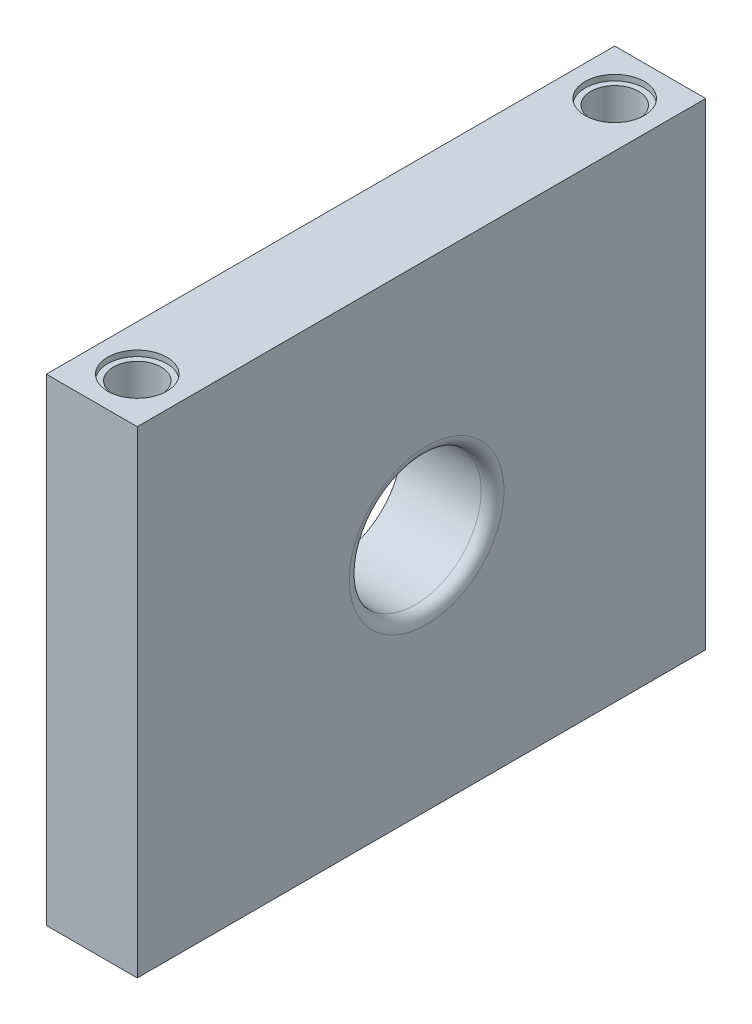
ISO-10303-21;
HEADER;
FILE_DESCRIPTION(('STEP AP214'),'2;1');
FILE_NAME('part.step','',(''),(''),'','','');
FILE_SCHEMA(('AUTOMOTIVE_DESIGN { 1 0 10303 214 1 1 1 1 }'));
ENDSEC;
DATA;
#1=APPLICATION_CONTEXT('core data for automotive mechanical design processes');
#2=APPLICATION_PROTOCOL_DEFINITION('international standard','automotive_design',2000,#1);
#3=PRODUCT_CONTEXT('',#1,'mechanical');
#4=PRODUCT('Part','Part','',(#3));
#5=PRODUCT_RELATED_PRODUCT_CATEGORY('part','',(#4));
#6=PRODUCT_DEFINITION_FORMATION('','',#4);
#7=PRODUCT_DEFINITION_CONTEXT('part definition',#1,'design');
#8=PRODUCT_DEFINITION('design','',#6,#7);
#9=PRODUCT_DEFINITION_SHAPE('','',#8);
#10=(LENGTH_UNIT() NAMED_UNIT(*) SI_UNIT(.MILLI.,.METRE.));
#11=(NAMED_UNIT(*) PLANE_ANGLE_UNIT() SI_UNIT($,.RADIAN.));
#12=(NAMED_UNIT(*) SI_UNIT($,.STERADIAN.) SOLID_ANGLE_UNIT());
#13=UNCERTAINTY_MEASURE_WITH_UNIT(LENGTH_MEASURE(1.E-05),#10,'distance_accuracy_value','');
#14=(GEOMETRIC_REPRESENTATION_CONTEXT(3) GLOBAL_UNCERTAINTY_ASSIGNED_CONTEXT((#13)) GLOBAL_UNIT_ASSIGNED_CONTEXT((#10,
#11,#12)) REPRESENTATION_CONTEXT('',''));
#15=CARTESIAN_POINT('',(0.,0.,0.));
#16=DIRECTION('',(0.,0.,1.));
#17=DIRECTION('',(1.,0.,0.));
#18=AXIS2_PLACEMENT_3D('',#15,#16,#17);
#19=CARTESIAN_POINT('',(-14.2230483271375,-42.,-32.3847583643123));
#20=DIRECTION('',(0.,1.,0.));
#21=DIRECTION('',(0.,0.,1.));
#22=AXIS2_PLACEMENT_3D('',#19,#20,#21);
#23=CYLINDRICAL_SURFACE('',#22,2.1);
#24=CARTESIAN_POINT('',(-14.2230483271375,-41.5,-32.3847583643123));
#25=DIRECTION('',(0.,-1.,0.));
#26=DIRECTION('',(0.,0.,-1.));
#27=AXIS2_PLACEMENT_3D('',#24,#25,#26);
#28=CIRCLE('',#27,2.1);
#29=CARTESIAN_POINT('',(-14.2230483271375,-41.5,-34.4847583643123));
#30=VERTEX_POINT('',#29);
#31=EDGE_CURVE('E91',#30,#30,#28,.T.);
#32=ORIENTED_EDGE('',*,*,#31,.T.);
#33=EDGE_LOOP('',(#32));
#34=FACE_BOUND('',#33,.T.);
#35=CARTESIAN_POINT('',(-14.2230483271375,-0.5,-32.3847583643123));
#36=DIRECTION('',(0.,1.,0.));
#37=DIRECTION('',(0.,0.,1.));
#38=AXIS2_PLACEMENT_3D('',#35,#36,#37);
#39=CIRCLE('',#38,2.1);
#40=CARTESIAN_POINT('',(-14.2230483271375,-0.5,-30.2847583643123));
#41=VERTEX_POINT('',#40);
#42=EDGE_CURVE('E41',#41,#41,#39,.F.);
#43=ORIENTED_EDGE('',*,*,#42,.F.);
#44=EDGE_LOOP('',(#43));
#45=FACE_BOUND('',#44,.T.);
#46=ADVANCED_FACE('F37',(#34,#45),#23,.F.);
#47=CARTESIAN_POINT('',(-14.2230483271375,-42.,9.61524163568774));
#48=DIRECTION('',(0.,1.,0.));
#49=DIRECTION('',(0.,0.,1.));
#50=AXIS2_PLACEMENT_3D('',#47,#48,#49);
#51=CYLINDRICAL_SURFACE('',#50,2.1);
#52=CARTESIAN_POINT('',(-14.2230483271375,-41.5,9.61524163568774));
#53=DIRECTION('',(0.,-1.,0.));
#54=DIRECTION('',(0.,0.,-1.));
#55=AXIS2_PLACEMENT_3D('',#52,#53,#54);
#56=CIRCLE('',#55,2.1);
#57=CARTESIAN_POINT('',(-14.2230483271375,-41.5,7.51524163568774));
#58=VERTEX_POINT('',#57);
#59=EDGE_CURVE('E107',#58,#58,#56,.F.);
#60=ORIENTED_EDGE('',*,*,#59,.F.);
#61=EDGE_LOOP('',(#60));
#62=FACE_BOUND('',#61,.T.);
#63=CARTESIAN_POINT('',(-14.2230483271375,-0.5,9.61524163568774));
#64=DIRECTION('',(0.,1.,0.));
#65=DIRECTION('',(0.,0.,1.));
#66=AXIS2_PLACEMENT_3D('',#63,#64,#65);
#67=CIRCLE('',#66,2.1);
#68=CARTESIAN_POINT('',(-14.2230483271375,-0.5,11.7152416356877));
#69=VERTEX_POINT('',#68);
#70=EDGE_CURVE('E105',#69,#69,#67,.T.);
#71=ORIENTED_EDGE('',*,*,#70,.T.);
#72=EDGE_LOOP('',(#71));
#73=FACE_BOUND('',#72,.T.);
#74=ADVANCED_FACE('F175',(#62,#73),#51,.F.);
#75=CARTESIAN_POINT('',(-10.2230483271375,3.,13.6152416356877));
#76=DIRECTION('',(0.,0.,-1.));
#77=DIRECTION('',(-1.,0.,0.));
#78=AXIS2_PLACEMENT_3D('',#75,#76,#77);
#79=PLANE('',#78);
#80=DIRECTION('',(0.,1.,0.));
#81=VECTOR('',#80,1.);
#82=CARTESIAN_POINT('',(-10.2230483271376,-42.,13.6152416356877));
#83=LINE('',#82,#81);
#84=CARTESIAN_POINT('',(-10.2230483271376,-42.,13.6152416356877));
#85=VERTEX_POINT('',#84);
#86=CARTESIAN_POINT('',(-10.2230483271376,0.,13.6152416356877));
#87=VERTEX_POINT('',#86);
#88=EDGE_CURVE('E90',#85,#87,#83,.T.);
#89=ORIENTED_EDGE('',*,*,#88,.T.);
#90=DIRECTION('',(1.,0.,0.));
#91=VECTOR('',#90,1.);
#92=CARTESIAN_POINT('',(14.7769516728625,0.,13.6152416356877));
#93=LINE('',#92,#91);
#94=CARTESIAN_POINT('',(-18.2230483271375,0.,13.6152416356877));
#95=VERTEX_POINT('',#94);
#96=EDGE_CURVE('E79',#95,#87,#93,.T.);
#97=ORIENTED_EDGE('',*,*,#96,.F.);
#98=DIRECTION('',(0.,1.,0.));
#99=VECTOR('',#98,1.);
#100=CARTESIAN_POINT('',(-18.2230483271375,3.,13.6152416356877));
#101=LINE('',#100,#99);
#102=CARTESIAN_POINT('',(-18.2230483271376,-42.,13.6152416356877));
#103=VERTEX_POINT('',#102);
#104=EDGE_CURVE('E55',#103,#95,#101,.T.);
#105=ORIENTED_EDGE('',*,*,#104,.F.);
#106=DIRECTION('',(-1.,0.,0.));
#107=VECTOR('',#106,1.);
#108=CARTESIAN_POINT('',(-18.2230483271376,-42.,13.6152416356877));
#109=LINE('',#108,#107);
#110=EDGE_CURVE('E147',#85,#103,#109,.T.);
#111=ORIENTED_EDGE('',*,*,#110,.F.);
#112=EDGE_LOOP('',(#89,#97,#105,#111));
#113=FACE_BOUND('',#112,.T.);
#114=ADVANCED_FACE('F88',(#113),#79,.F.);
#115=CARTESIAN_POINT('',(-10.2230483271376,3.,-36.3847583643123));
#116=DIRECTION('',(0.,0.,1.));
#117=DIRECTION('',(1.,0.,0.));
#118=AXIS2_PLACEMENT_3D('',#115,#116,#117);
#119=PLANE('',#118);
#120=DIRECTION('',(0.,-1.,0.));
#121=VECTOR('',#120,1.);
#122=CARTESIAN_POINT('',(-18.2230483271376,3.,-36.3847583643123));
#123=LINE('',#122,#121);
#124=CARTESIAN_POINT('',(-18.2230483271376,0.,-36.3847583643123));
#125=VERTEX_POINT('',#124);
#126=CARTESIAN_POINT('',(-18.2230483271376,-42.,-36.3847583643123));
#127=VERTEX_POINT('',#126);
#128=EDGE_CURVE('E98',#125,#127,#123,.T.);
#129=ORIENTED_EDGE('',*,*,#128,.F.);
#130=DIRECTION('',(1.,0.,0.));
#131=VECTOR('',#130,1.);
#132=CARTESIAN_POINT('',(14.7769516728625,0.,-36.3847583643123));
#133=LINE('',#132,#131);
#134=CARTESIAN_POINT('',(-10.2230483271376,0.,-36.3847583643123));
#135=VERTEX_POINT('',#134);
#136=EDGE_CURVE('E82',#125,#135,#133,.T.);
#137=ORIENTED_EDGE('',*,*,#136,.T.);
#138=DIRECTION('',(0.,1.,0.));
#139=VECTOR('',#138,1.);
#140=CARTESIAN_POINT('',(-10.2230483271376,-42.,-36.3847583643123));
#141=LINE('',#140,#139);
#142=CARTESIAN_POINT('',(-10.2230483271376,-42.,-36.3847583643123));
#143=VERTEX_POINT('',#142);
#144=EDGE_CURVE('E102',#143,#135,#141,.T.);
#145=ORIENTED_EDGE('',*,*,#144,.F.);
#146=DIRECTION('',(1.,0.,0.));
#147=VECTOR('',#146,1.);
#148=CARTESIAN_POINT('',(-18.2230483271376,-42.,-36.3847583643123));
#149=LINE('',#148,#147);
#150=EDGE_CURVE('E143',#127,#143,#149,.T.);
#151=ORIENTED_EDGE('',*,*,#150,.F.);
#152=EDGE_LOOP('',(#129,#137,#145,#151));
#153=FACE_BOUND('',#152,.T.);
#154=ADVANCED_FACE('F157',(#153),#119,.F.);
#155=CARTESIAN_POINT('',(-18.2230483271375,0.,0.));
#156=DIRECTION('',(-1.,0.,0.));
#157=DIRECTION('',(0.,0.,1.));
#158=AXIS2_PLACEMENT_3D('',#155,#156,#157);
#159=PLANE('',#158);
#160=DIRECTION('',(0.,0.,1.));
#161=VECTOR('',#160,1.);
#162=CARTESIAN_POINT('',(-18.2230483271375,0.,0.));
#163=LINE('',#162,#161);
#164=EDGE_CURVE('E77',#125,#95,#163,.T.);
#165=ORIENTED_EDGE('',*,*,#164,.F.);
#166=ORIENTED_EDGE('',*,*,#128,.T.);
#167=DIRECTION('',(0.,0.,-1.));
#168=VECTOR('',#167,1.);
#169=CARTESIAN_POINT('',(-18.2230483271376,-42.,-36.3847583643123));
#170=LINE('',#169,#168);
#171=EDGE_CURVE('E97',#103,#127,#170,.T.);
#172=ORIENTED_EDGE('',*,*,#171,.F.);
#173=ORIENTED_EDGE('',*,*,#104,.T.);
#174=EDGE_LOOP('',(#165,#166,#172,#173));
#175=FACE_BOUND('',#174,.T.);
#176=CARTESIAN_POINT('',(-18.2230483271375,-21.,-11.836279123996));
#177=DIRECTION('',(-1.,0.,0.));
#178=DIRECTION('',(0.,0.,1.));
#179=AXIS2_PLACEMENT_3D('',#176,#177,#178);
#180=CIRCLE('',#179,5.80237020535575);
#181=CARTESIAN_POINT('',(-18.2230483271375,-21.,-6.03390891864026));
#182=VERTEX_POINT('',#181);
#183=EDGE_CURVE('E85',#182,#182,#180,.T.);
#184=ORIENTED_EDGE('',*,*,#183,.F.);
#185=EDGE_LOOP('',(#184));
#186=FACE_BOUND('',#185,.T.);
#187=ADVANCED_FACE('F94',(#175,#186),#159,.T.);
#188=CARTESIAN_POINT('',(-10.2230483271376,-42.,-36.3847583643123));
#189=DIRECTION('',(-1.,0.,0.));
#190=DIRECTION('',(0.,0.,1.));
#191=AXIS2_PLACEMENT_3D('',#188,#189,#190);
#192=PLANE('',#191);
#193=CARTESIAN_POINT('',(-10.2230483271376,-21.,-11.836279123996));
#194=DIRECTION('',(-1.,0.,0.));
#195=DIRECTION('',(0.,0.,1.));
#196=AXIS2_PLACEMENT_3D('',#193,#194,#195);
#197=CIRCLE('',#196,6.80237020535575);
#198=CARTESIAN_POINT('',(-10.2230483271376,-21.,-5.03390891864026));
#199=VERTEX_POINT('',#198);
#200=EDGE_CURVE('E47',#199,#199,#197,.T.);
#201=ORIENTED_EDGE('',*,*,#200,.T.);
#202=EDGE_LOOP('',(#201));
#203=FACE_BOUND('',#202,.T.);
#204=DIRECTION('',(0.,0.,1.));
#205=VECTOR('',#204,1.);
#206=CARTESIAN_POINT('',(-10.2230483271376,0.,-36.3847583643123));
#207=LINE('',#206,#205);
#208=EDGE_CURVE('E133',#135,#87,#207,.T.);
#209=ORIENTED_EDGE('',*,*,#208,.T.);
#210=ORIENTED_EDGE('',*,*,#88,.F.);
#211=DIRECTION('',(0.,0.,1.));
#212=VECTOR('',#211,1.);
#213=CARTESIAN_POINT('',(-10.2230483271376,-42.,-36.3847583643123));
#214=LINE('',#213,#212);
#215=EDGE_CURVE('E145',#143,#85,#214,.T.);
#216=ORIENTED_EDGE('',*,*,#215,.F.);
#217=ORIENTED_EDGE('',*,*,#144,.T.);
#218=EDGE_LOOP('',(#209,#210,#216,#217));
#219=FACE_BOUND('',#218,.T.);
#220=ADVANCED_FACE('F154',(#203,#219),#192,.F.);
#221=CARTESIAN_POINT('',(0.,-42.,0.));
#222=DIRECTION('',(0.,1.,0.));
#223=DIRECTION('',(0.,0.,1.));
#224=AXIS2_PLACEMENT_3D('',#221,#222,#223);
#225=PLANE('',#224);
#226=CARTESIAN_POINT('',(-14.2230483271375,-42.,-32.3847583643123));
#227=DIRECTION('',(0.,1.,0.));
#228=DIRECTION('',(0.,0.,1.));
#229=AXIS2_PLACEMENT_3D('',#226,#227,#228);
#230=CIRCLE('',#229,2.65);
#231=CARTESIAN_POINT('',(-14.2230483271375,-42.,-29.7347583643123));
#232=VERTEX_POINT('',#231);
#233=EDGE_CURVE('E134',#232,#232,#230,.T.);
#234=ORIENTED_EDGE('',*,*,#233,.T.);
#235=EDGE_LOOP('',(#234));
#236=FACE_BOUND('',#235,.T.);
#237=CARTESIAN_POINT('',(-14.2230483271375,-42.,9.61524163568773));
#238=DIRECTION('',(0.,1.,0.));
#239=DIRECTION('',(0.,0.,1.));
#240=AXIS2_PLACEMENT_3D('',#237,#238,#239);
#241=CIRCLE('',#240,2.65);
#242=CARTESIAN_POINT('',(-14.2230483271375,-42.,12.2652416356877));
#243=VERTEX_POINT('',#242);
#244=EDGE_CURVE('E129',#243,#243,#241,.T.);
#245=ORIENTED_EDGE('',*,*,#244,.T.);
#246=EDGE_LOOP('',(#245));
#247=FACE_BOUND('',#246,.T.);
#248=ORIENTED_EDGE('',*,*,#171,.T.);
#249=ORIENTED_EDGE('',*,*,#150,.T.);
#250=ORIENTED_EDGE('',*,*,#215,.T.);
#251=ORIENTED_EDGE('',*,*,#110,.T.);
#252=EDGE_LOOP('',(#248,#249,#250,#251));
#253=FACE_BOUND('',#252,.T.);
#254=ADVANCED_FACE('F159',(#236,#247,#253),#225,.F.);
#255=CARTESIAN_POINT('',(-14.2230483271375,-41.5,9.61524163568773));
#256=DIRECTION('',(0.,-1.,0.));
#257=DIRECTION('',(0.,0.,-1.));
#258=AXIS2_PLACEMENT_3D('',#255,#256,#257);
#259=CYLINDRICAL_SURFACE('',#258,2.65);
#260=CARTESIAN_POINT('',(-14.2230483271375,-41.5,9.61524163568773));
#261=DIRECTION('',(0.,1.,0.));
#262=DIRECTION('',(0.,0.,1.));
#263=AXIS2_PLACEMENT_3D('',#260,#261,#262);
#264=CIRCLE('',#263,2.65);
#265=CARTESIAN_POINT('',(-14.2230483271375,-41.5,12.2652416356877));
#266=VERTEX_POINT('',#265);
#267=EDGE_CURVE('E137',#266,#266,#264,.T.);
#268=ORIENTED_EDGE('',*,*,#267,.T.);
#269=EDGE_LOOP('',(#268));
#270=FACE_BOUND('',#269,.T.);
#271=ORIENTED_EDGE('',*,*,#244,.F.);
#272=EDGE_LOOP('',(#271));
#273=FACE_BOUND('',#272,.T.);
#274=ADVANCED_FACE('F161',(#270,#273),#259,.F.);
#275=CARTESIAN_POINT('',(-14.2230483271375,-41.5,9.61524163568773));
#276=DIRECTION('',(0.,-1.,0.));
#277=DIRECTION('',(0.,0.,1.));
#278=AXIS2_PLACEMENT_3D('',#275,#276,#277);
#279=PLANE('',#278);
#280=ORIENTED_EDGE('',*,*,#59,.T.);
#281=EDGE_LOOP('',(#280));
#282=FACE_BOUND('',#281,.T.);
#283=ORIENTED_EDGE('',*,*,#267,.F.);
#284=EDGE_LOOP('',(#283));
#285=FACE_BOUND('',#284,.T.);
#286=ADVANCED_FACE('F168',(#282,#285),#279,.T.);
#287=CARTESIAN_POINT('',(-14.2230483271375,-41.5,-32.3847583643123));
#288=DIRECTION('',(0.,-1.,0.));
#289=DIRECTION('',(0.,0.,-1.));
#290=AXIS2_PLACEMENT_3D('',#287,#288,#289);
#291=CYLINDRICAL_SURFACE('',#290,2.65);
#292=CARTESIAN_POINT('',(-14.2230483271375,-41.5,-32.3847583643123));
#293=DIRECTION('',(0.,1.,0.));
#294=DIRECTION('',(0.,0.,1.));
#295=AXIS2_PLACEMENT_3D('',#292,#293,#294);
#296=CIRCLE('',#295,2.65);
#297=CARTESIAN_POINT('',(-14.2230483271375,-41.5,-29.7347583643123));
#298=VERTEX_POINT('',#297);
#299=EDGE_CURVE('E130',#298,#298,#296,.T.);
#300=ORIENTED_EDGE('',*,*,#299,.T.);
#301=EDGE_LOOP('',(#300));
#302=FACE_BOUND('',#301,.T.);
#303=ORIENTED_EDGE('',*,*,#233,.F.);
#304=EDGE_LOOP('',(#303));
#305=FACE_BOUND('',#304,.T.);
#306=ADVANCED_FACE('F197',(#302,#305),#291,.F.);
#307=CARTESIAN_POINT('',(-14.2230483271375,-41.5,-32.3847583643123));
#308=DIRECTION('',(0.,-1.,0.));
#309=DIRECTION('',(0.,0.,1.));
#310=AXIS2_PLACEMENT_3D('',#307,#308,#309);
#311=PLANE('',#310);
#312=ORIENTED_EDGE('',*,*,#31,.F.);
#313=EDGE_LOOP('',(#312));
#314=FACE_BOUND('',#313,.T.);
#315=ORIENTED_EDGE('',*,*,#299,.F.);
#316=EDGE_LOOP('',(#315));
#317=FACE_BOUND('',#316,.T.);
#318=ADVANCED_FACE('F193',(#314,#317),#311,.T.);
#319=CARTESIAN_POINT('',(-9.22304832713755,-21.,-11.836279123996));
#320=DIRECTION('',(-1.,0.,0.));
#321=DIRECTION('',(0.,0.,1.));
#322=AXIS2_PLACEMENT_3D('',#319,#320,#321);
#323=CYLINDRICAL_SURFACE('',#322,5.80237020535575);
#324=CARTESIAN_POINT('',(-11.2230483271376,-21.,-11.836279123996));
#325=DIRECTION('',(-1.,0.,0.));
#326=DIRECTION('',(0.,0.,1.));
#327=AXIS2_PLACEMENT_3D('',#324,#325,#326);
#328=CIRCLE('',#327,5.80237020535575);
#329=CARTESIAN_POINT('',(-11.2230483271376,-21.,-6.03390891864026));
#330=VERTEX_POINT('',#329);
#331=EDGE_CURVE('E11',#330,#330,#328,.F.);
#332=ORIENTED_EDGE('',*,*,#331,.T.);
#333=EDGE_LOOP('',(#332));
#334=FACE_BOUND('',#333,.T.);
#335=ORIENTED_EDGE('',*,*,#183,.T.);
#336=EDGE_LOOP('',(#335));
#337=FACE_BOUND('',#336,.T.);
#338=ADVANCED_FACE('F190',(#334,#337),#323,.F.);
#339=CARTESIAN_POINT('',(-11.2230483271376,-21.,-11.836279123996));
#340=DIRECTION('',(-1.,0.,0.));
#341=DIRECTION('',(0.,0.,1.));
#342=AXIS2_PLACEMENT_3D('',#339,#340,#341);
#343=TOROIDAL_SURFACE('',#342,6.80237020535575,1.);
#344=ORIENTED_EDGE('',*,*,#331,.F.);
#345=EDGE_LOOP('',(#344));
#346=FACE_BOUND('',#345,.T.);
#347=ORIENTED_EDGE('',*,*,#200,.F.);
#348=EDGE_LOOP('',(#347));
#349=FACE_BOUND('',#348,.T.);
#350=ADVANCED_FACE('F39',(#346,#349),#343,.T.);
#351=CARTESIAN_POINT('',(14.7769516728625,0.,-36.3847583643123));
#352=DIRECTION('',(0.,-1.,0.));
#353=DIRECTION('',(0.,0.,-1.));
#354=AXIS2_PLACEMENT_3D('',#351,#352,#353);
#355=PLANE('',#354);
#356=CARTESIAN_POINT('',(-14.2230483271375,0.,-32.3847583643123));
#357=DIRECTION('',(0.,-1.,0.));
#358=DIRECTION('',(0.,0.,-1.));
#359=AXIS2_PLACEMENT_3D('',#356,#357,#358);
#360=CIRCLE('',#359,2.6);
#361=CARTESIAN_POINT('',(-14.2230483271375,0.,-34.9847583643123));
#362=VERTEX_POINT('',#361);
#363=EDGE_CURVE('E121',#362,#362,#360,.T.);
#364=ORIENTED_EDGE('',*,*,#363,.T.);
#365=EDGE_LOOP('',(#364));
#366=FACE_BOUND('',#365,.T.);
#367=CARTESIAN_POINT('',(-14.2230483271375,0.,9.61524163568774));
#368=DIRECTION('',(0.,1.,0.));
#369=DIRECTION('',(0.,0.,1.));
#370=AXIS2_PLACEMENT_3D('',#367,#368,#369);
#371=CIRCLE('',#370,2.6);
#372=CARTESIAN_POINT('',(-14.2230483271375,0.,12.2152416356877));
#373=VERTEX_POINT('',#372);
#374=EDGE_CURVE('E114',#373,#373,#371,.T.);
#375=ORIENTED_EDGE('',*,*,#374,.F.);
#376=EDGE_LOOP('',(#375));
#377=FACE_BOUND('',#376,.T.);
#378=ORIENTED_EDGE('',*,*,#164,.T.);
#379=ORIENTED_EDGE('',*,*,#96,.T.);
#380=ORIENTED_EDGE('',*,*,#208,.F.);
#381=ORIENTED_EDGE('',*,*,#136,.F.);
#382=EDGE_LOOP('',(#378,#379,#380,#381));
#383=FACE_BOUND('',#382,.T.);
#384=ADVANCED_FACE('F78',(#366,#377,#383),#355,.F.);
#385=CARTESIAN_POINT('',(-14.2230483271375,-0.5,9.61524163568774));
#386=DIRECTION('',(0.,1.,0.));
#387=DIRECTION('',(0.,0.,1.));
#388=AXIS2_PLACEMENT_3D('',#385,#386,#387);
#389=CYLINDRICAL_SURFACE('',#388,2.6);
#390=CARTESIAN_POINT('',(-14.2230483271375,-0.5,9.61524163568774));
#391=DIRECTION('',(0.,1.,0.));
#392=DIRECTION('',(0.,0.,1.));
#393=AXIS2_PLACEMENT_3D('',#390,#391,#392);
#394=CIRCLE('',#393,2.6);
#395=CARTESIAN_POINT('',(-14.2230483271375,-0.5,12.2152416356877));
#396=VERTEX_POINT('',#395);
#397=EDGE_CURVE('E108',#396,#396,#394,.T.);
#398=ORIENTED_EDGE('',*,*,#397,.F.);
#399=EDGE_LOOP('',(#398));
#400=FACE_BOUND('',#399,.T.);
#401=ORIENTED_EDGE('',*,*,#374,.T.);
#402=EDGE_LOOP('',(#401));
#403=FACE_BOUND('',#402,.T.);
#404=ADVANCED_FACE('F188',(#400,#403),#389,.F.);
#405=CARTESIAN_POINT('',(-14.2230483271375,-0.5,9.61524163568774));
#406=DIRECTION('',(0.,1.,0.));
#407=DIRECTION('',(0.,0.,1.));
#408=AXIS2_PLACEMENT_3D('',#405,#406,#407);
#409=PLANE('',#408);
#410=ORIENTED_EDGE('',*,*,#70,.F.);
#411=EDGE_LOOP('',(#410));
#412=FACE_BOUND('',#411,.T.);
#413=ORIENTED_EDGE('',*,*,#397,.T.);
#414=EDGE_LOOP('',(#413));
#415=FACE_BOUND('',#414,.T.);
#416=ADVANCED_FACE('F245',(#412,#415),#409,.T.);
#417=CARTESIAN_POINT('',(-14.2230483271375,-0.5,-32.3847583643123));
#418=DIRECTION('',(0.,1.,0.));
#419=DIRECTION('',(0.,0.,-1.));
#420=AXIS2_PLACEMENT_3D('',#417,#418,#419);
#421=PLANE('',#420);
#422=CARTESIAN_POINT('',(-14.2230483271375,-0.5,-32.3847583643123));
#423=DIRECTION('',(0.,-1.,0.));
#424=DIRECTION('',(0.,0.,-1.));
#425=AXIS2_PLACEMENT_3D('',#422,#423,#424);
#426=CIRCLE('',#425,2.6);
#427=CARTESIAN_POINT('',(-14.2230483271375,-0.5,-34.9847583643123));
#428=VERTEX_POINT('',#427);
#429=EDGE_CURVE('E352',#428,#428,#426,.T.);
#430=ORIENTED_EDGE('',*,*,#429,.F.);
#431=EDGE_LOOP('',(#430));
#432=FACE_BOUND('',#431,.T.);
#433=ORIENTED_EDGE('',*,*,#42,.T.);
#434=EDGE_LOOP('',(#433));
#435=FACE_BOUND('',#434,.T.);
#436=ADVANCED_FACE('F252',(#432,#435),#421,.T.);
#437=CARTESIAN_POINT('',(-14.2230483271375,-0.5,-32.3847583643123));
#438=DIRECTION('',(0.,1.,0.));
#439=DIRECTION('',(0.,0.,1.));
#440=AXIS2_PLACEMENT_3D('',#437,#438,#439);
#441=CYLINDRICAL_SURFACE('',#440,2.6);
#442=ORIENTED_EDGE('',*,*,#429,.T.);
#443=EDGE_LOOP('',(#442));
#444=FACE_BOUND('',#443,.T.);
#445=ORIENTED_EDGE('',*,*,#363,.F.);
#446=EDGE_LOOP('',(#445));
#447=FACE_BOUND('',#446,.T.);
#448=ADVANCED_FACE('F259',(#444,#447),#441,.F.);
#449=CLOSED_SHELL('',(#46,#74,#114,#154,#187,#220,#254,#274,#286,#306,#318,#338,#350,#384,#404,
#416,#436,#448));
#450=MANIFOLD_SOLID_BREP('B2',#449);
#451=ADVANCED_BREP_SHAPE_REPRESENTATION('',(#18,#450),#14);
#452=SHAPE_DEFINITION_REPRESENTATION(#9,#451);
ENDSEC;
END-ISO-10303-21;
